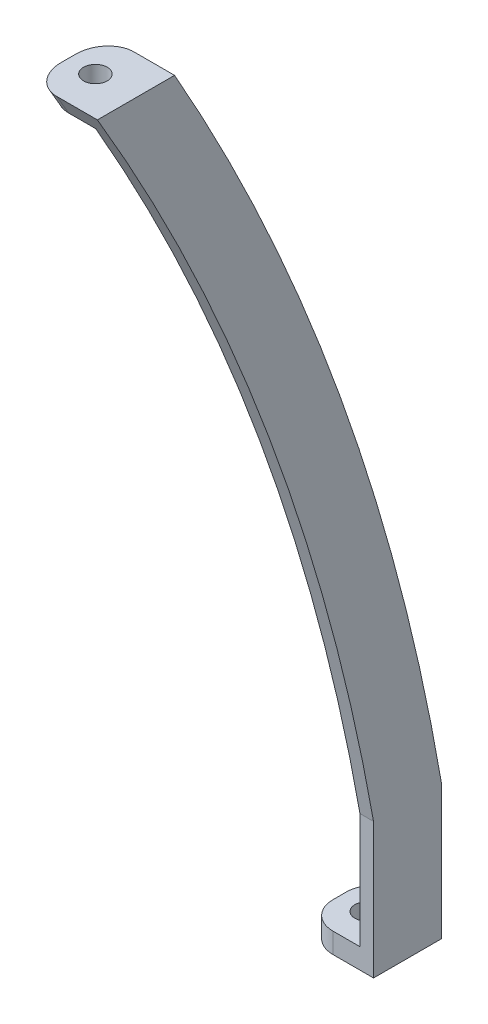
ISO-10303-21;
HEADER;
FILE_DESCRIPTION(('STEP AP214'),'2;1');
FILE_NAME('part.step','',(''),(''),'','','');
FILE_SCHEMA(('AUTOMOTIVE_DESIGN { 1 0 10303 214 1 1 1 1 }'));
ENDSEC;
DATA;
#1=APPLICATION_CONTEXT('core data for automotive mechanical design processes');
#2=APPLICATION_PROTOCOL_DEFINITION('international standard','automotive_design',2000,#1);
#3=PRODUCT_CONTEXT('',#1,'mechanical');
#4=PRODUCT('Part','Part','',(#3));
#5=PRODUCT_RELATED_PRODUCT_CATEGORY('part','',(#4));
#6=PRODUCT_DEFINITION_FORMATION('','',#4);
#7=PRODUCT_DEFINITION_CONTEXT('part definition',#1,'design');
#8=PRODUCT_DEFINITION('design','',#6,#7);
#9=PRODUCT_DEFINITION_SHAPE('','',#8);
#10=(LENGTH_UNIT() NAMED_UNIT(*) SI_UNIT(.MILLI.,.METRE.));
#11=(NAMED_UNIT(*) PLANE_ANGLE_UNIT() SI_UNIT($,.RADIAN.));
#12=(NAMED_UNIT(*) SI_UNIT($,.STERADIAN.) SOLID_ANGLE_UNIT());
#13=UNCERTAINTY_MEASURE_WITH_UNIT(LENGTH_MEASURE(1.E-05),#10,'distance_accuracy_value','');
#14=(GEOMETRIC_REPRESENTATION_CONTEXT(3) GLOBAL_UNCERTAINTY_ASSIGNED_CONTEXT((#13)) GLOBAL_UNIT_ASSIGNED_CONTEXT((#10,
#11,#12)) REPRESENTATION_CONTEXT('',''));
#15=CARTESIAN_POINT('',(0.,0.,0.));
#16=DIRECTION('',(0.,0.,1.));
#17=DIRECTION('',(1.,0.,0.));
#18=AXIS2_PLACEMENT_3D('',#15,#16,#17);
#19=CARTESIAN_POINT('',(2.,0.,0.));
#20=DIRECTION('',(0.,0.,-1.));
#21=DIRECTION('',(-1.,0.,0.));
#22=AXIS2_PLACEMENT_3D('',#19,#20,#21);
#23=PLANE('',#22);
#24=DIRECTION('',(1.,0.,0.));
#25=VECTOR('',#24,1.);
#26=CARTESIAN_POINT('',(-8.,3.,0.));
#27=LINE('',#26,#25);
#28=CARTESIAN_POINT('',(-4.,3.,0.));
#29=VERTEX_POINT('',#28);
#30=CARTESIAN_POINT('',(0.,3.,0.));
#31=VERTEX_POINT('',#30);
#32=EDGE_CURVE('E513',#29,#31,#27,.T.);
#33=ORIENTED_EDGE('',*,*,#32,.F.);
#34=DIRECTION('',(0.,-1.,0.));
#35=VECTOR('',#34,1.);
#36=CARTESIAN_POINT('',(-4.,0.,0.));
#37=LINE('',#36,#35);
#38=CARTESIAN_POINT('',(-4.,0.,0.));
#39=VERTEX_POINT('',#38);
#40=EDGE_CURVE('E11',#29,#39,#37,.T.);
#41=ORIENTED_EDGE('',*,*,#40,.T.);
#42=DIRECTION('',(-1.,0.,0.));
#43=VECTOR('',#42,1.);
#44=CARTESIAN_POINT('',(2.,0.,0.));
#45=LINE('',#44,#43);
#46=CARTESIAN_POINT('',(2.,0.,0.));
#47=VERTEX_POINT('',#46);
#48=EDGE_CURVE('E213',#47,#39,#45,.T.);
#49=ORIENTED_EDGE('',*,*,#48,.F.);
#50=DIRECTION('',(0.,-1.,0.));
#51=VECTOR('',#50,1.);
#52=CARTESIAN_POINT('',(2.,0.,0.));
#53=LINE('',#52,#51);
#54=CARTESIAN_POINT('',(2.,20.,0.));
#55=VERTEX_POINT('',#54);
#56=EDGE_CURVE('E182',#55,#47,#53,.T.);
#57=ORIENTED_EDGE('',*,*,#56,.F.);
#58=DIRECTION('',(-1.,0.,0.));
#59=VECTOR('',#58,1.);
#60=CARTESIAN_POINT('',(2.,20.,0.));
#61=LINE('',#60,#59);
#62=CARTESIAN_POINT('',(0.,20.,0.));
#63=VERTEX_POINT('',#62);
#64=EDGE_CURVE('E194',#55,#63,#61,.T.);
#65=ORIENTED_EDGE('',*,*,#64,.T.);
#66=DIRECTION('',(0.,-1.,0.));
#67=VECTOR('',#66,1.);
#68=CARTESIAN_POINT('',(0.,0.,0.));
#69=LINE('',#68,#67);
#70=EDGE_CURVE('E180',#63,#31,#69,.T.);
#71=ORIENTED_EDGE('',*,*,#70,.T.);
#72=EDGE_LOOP('',(#33,#41,#49,#57,#65,#71));
#73=FACE_BOUND('',#72,.T.);
#74=ADVANCED_FACE('F43',(#73),#23,.F.);
#75=CARTESIAN_POINT('',(2.,0.,0.));
#76=DIRECTION('',(0.,1.,0.));
#77=DIRECTION('',(0.,0.,1.));
#78=AXIS2_PLACEMENT_3D('',#75,#76,#77);
#79=PLANE('',#78);
#80=CARTESIAN_POINT('',(-4.,0.,-5.));
#81=DIRECTION('',(0.,1.,0.));
#82=DIRECTION('',(0.,0.,1.));
#83=AXIS2_PLACEMENT_3D('',#80,#81,#82);
#84=CIRCLE('',#83,1.75);
#85=CARTESIAN_POINT('',(-4.,0.,-3.25));
#86=VERTEX_POINT('',#85);
#87=EDGE_CURVE('E485',#86,#86,#84,.T.);
#88=ORIENTED_EDGE('',*,*,#87,.T.);
#89=EDGE_LOOP('',(#88));
#90=FACE_BOUND('',#89,.T.);
#91=DIRECTION('',(0.,0.,-1.));
#92=VECTOR('',#91,1.);
#93=CARTESIAN_POINT('',(-8.,0.,0.));
#94=LINE('',#93,#92);
#95=CARTESIAN_POINT('',(-8.,0.,-4.));
#96=VERTEX_POINT('',#95);
#97=CARTESIAN_POINT('',(-8.,0.,-6.));
#98=VERTEX_POINT('',#97);
#99=EDGE_CURVE('E503',#96,#98,#94,.T.);
#100=ORIENTED_EDGE('',*,*,#99,.T.);
#101=CARTESIAN_POINT('',(-4.,0.,-6.));
#102=DIRECTION('',(0.,1.,0.));
#103=DIRECTION('',(0.,0.,1.));
#104=AXIS2_PLACEMENT_3D('',#101,#102,#103);
#105=CIRCLE('',#104,4.);
#106=CARTESIAN_POINT('',(-4.,0.,-10.));
#107=VERTEX_POINT('',#106);
#108=EDGE_CURVE('E53',#98,#107,#105,.F.);
#109=ORIENTED_EDGE('',*,*,#108,.T.);
#110=DIRECTION('',(-1.,0.,0.));
#111=VECTOR('',#110,1.);
#112=CARTESIAN_POINT('',(2.,0.,-10.));
#113=LINE('',#112,#111);
#114=CARTESIAN_POINT('',(2.,0.,-10.));
#115=VERTEX_POINT('',#114);
#116=EDGE_CURVE('E209',#115,#107,#113,.T.);
#117=ORIENTED_EDGE('',*,*,#116,.F.);
#118=DIRECTION('',(0.,0.,-1.));
#119=VECTOR('',#118,1.);
#120=CARTESIAN_POINT('',(2.,0.,0.));
#121=LINE('',#120,#119);
#122=EDGE_CURVE('E188',#47,#115,#121,.T.);
#123=ORIENTED_EDGE('',*,*,#122,.F.);
#124=ORIENTED_EDGE('',*,*,#48,.T.);
#125=CARTESIAN_POINT('',(-4.,0.,-4.));
#126=DIRECTION('',(0.,1.,0.));
#127=DIRECTION('',(0.,0.,1.));
#128=AXIS2_PLACEMENT_3D('',#125,#126,#127);
#129=CIRCLE('',#128,4.);
#130=EDGE_CURVE('E61',#39,#96,#129,.F.);
#131=ORIENTED_EDGE('',*,*,#130,.T.);
#132=EDGE_LOOP('',(#100,#109,#117,#123,#124,#131));
#133=FACE_BOUND('',#132,.T.);
#134=ADVANCED_FACE('F254',(#90,#133),#79,.F.);
#135=CARTESIAN_POINT('',(2.,0.,-10.));
#136=DIRECTION('',(0.,0.,1.));
#137=DIRECTION('',(1.,0.,0.));
#138=AXIS2_PLACEMENT_3D('',#135,#136,#137);
#139=PLANE('',#138);
#140=ORIENTED_EDGE('',*,*,#116,.T.);
#141=DIRECTION('',(0.,1.,0.));
#142=VECTOR('',#141,1.);
#143=CARTESIAN_POINT('',(-4.,3.,-10.));
#144=LINE('',#143,#142);
#145=CARTESIAN_POINT('',(-4.,3.,-10.));
#146=VERTEX_POINT('',#145);
#147=EDGE_CURVE('E545',#107,#146,#144,.T.);
#148=ORIENTED_EDGE('',*,*,#147,.T.);
#149=DIRECTION('',(1.,0.,0.));
#150=VECTOR('',#149,1.);
#151=CARTESIAN_POINT('',(-8.,3.,-10.));
#152=LINE('',#151,#150);
#153=CARTESIAN_POINT('',(0.,3.,-10.));
#154=VERTEX_POINT('',#153);
#155=EDGE_CURVE('E510',#146,#154,#152,.T.);
#156=ORIENTED_EDGE('',*,*,#155,.T.);
#157=DIRECTION('',(0.,1.,0.));
#158=VECTOR('',#157,1.);
#159=CARTESIAN_POINT('',(0.,0.,-10.));
#160=LINE('',#159,#158);
#161=CARTESIAN_POINT('',(0.,20.,-10.));
#162=VERTEX_POINT('',#161);
#163=EDGE_CURVE('E190',#154,#162,#160,.T.);
#164=ORIENTED_EDGE('',*,*,#163,.T.);
#165=DIRECTION('',(-1.,0.,0.));
#166=VECTOR('',#165,1.);
#167=CARTESIAN_POINT('',(2.,20.,-10.));
#168=LINE('',#167,#166);
#169=CARTESIAN_POINT('',(2.,20.,-10.));
#170=VERTEX_POINT('',#169);
#171=EDGE_CURVE('E205',#170,#162,#168,.T.);
#172=ORIENTED_EDGE('',*,*,#171,.F.);
#173=DIRECTION('',(0.,1.,0.));
#174=VECTOR('',#173,1.);
#175=CARTESIAN_POINT('',(2.,0.,-10.));
#176=LINE('',#175,#174);
#177=EDGE_CURVE('E520',#115,#170,#176,.T.);
#178=ORIENTED_EDGE('',*,*,#177,.F.);
#179=EDGE_LOOP('',(#140,#148,#156,#164,#172,#178));
#180=FACE_BOUND('',#179,.T.);
#181=ADVANCED_FACE('F250',(#180),#139,.F.);
#182=CARTESIAN_POINT('',(2.,-37.6515685831569,324.556822155279));
#183=DIRECTION('',(-1.,0.,0.));
#184=DIRECTION('',(0.,0.,1.));
#185=AXIS2_PLACEMENT_3D('',#182,#183,#184);
#186=CYLINDRICAL_SURFACE('',#185,339.487806276952);
#187=DIRECTION('',(1.,0.,0.));
#188=VECTOR('',#187,1.);
#189=CARTESIAN_POINT('',(-8.,127.,27.6699218483719));
#190=LINE('',#189,#188);
#191=CARTESIAN_POINT('',(-4.,127.,27.6699218483719));
#192=VERTEX_POINT('',#191);
#193=CARTESIAN_POINT('',(0.,127.,27.6699218483719));
#194=VERTEX_POINT('',#193);
#195=EDGE_CURVE('E162',#192,#194,#190,.T.);
#196=ORIENTED_EDGE('',*,*,#195,.F.);
#197=CARTESIAN_POINT('',(-4.,-37.6515685831569,324.556822155279));
#198=DIRECTION('',(-1.,0.,0.));
#199=DIRECTION('',(0.,0.,1.));
#200=AXIS2_PLACEMENT_3D('',#197,#198,#199);
#201=CIRCLE('',#200,339.487806276952);
#202=CARTESIAN_POINT('',(-4.,130.,29.3536342281421));
#203=VERTEX_POINT('',#202);
#204=EDGE_CURVE('E217',#192,#203,#201,.F.);
#205=ORIENTED_EDGE('',*,*,#204,.T.);
#206=DIRECTION('',(-1.,0.,0.));
#207=VECTOR('',#206,1.);
#208=CARTESIAN_POINT('',(2.,130.,29.3536342281421));
#209=LINE('',#208,#207);
#210=CARTESIAN_POINT('',(2.,130.,29.3536342281421));
#211=VERTEX_POINT('',#210);
#212=EDGE_CURVE('E201',#211,#203,#209,.T.);
#213=ORIENTED_EDGE('',*,*,#212,.F.);
#214=CARTESIAN_POINT('',(2.,-37.6515685831569,324.556822155279));
#215=DIRECTION('',(1.,0.,0.));
#216=DIRECTION('',(0.,0.,-1.));
#217=AXIS2_PLACEMENT_3D('',#214,#215,#216);
#218=CIRCLE('',#217,339.487806276952);
#219=EDGE_CURVE('E523',#170,#211,#218,.T.);
#220=ORIENTED_EDGE('',*,*,#219,.F.);
#221=ORIENTED_EDGE('',*,*,#171,.T.);
#222=CARTESIAN_POINT('',(0.,-37.6515685831569,324.556822155279));
#223=DIRECTION('',(1.,0.,0.));
#224=DIRECTION('',(0.,0.,-1.));
#225=AXIS2_PLACEMENT_3D('',#222,#223,#224);
#226=CIRCLE('',#225,339.487806276952);
#227=EDGE_CURVE('E183',#162,#194,#226,.T.);
#228=ORIENTED_EDGE('',*,*,#227,.T.);
#229=EDGE_LOOP('',(#196,#205,#213,#220,#221,#228));
#230=FACE_BOUND('',#229,.T.);
#231=ADVANCED_FACE('F244',(#230),#186,.T.);
#232=CARTESIAN_POINT('',(2.,130.,40.7368339246421));
#233=DIRECTION('',(0.,-1.,0.));
#234=DIRECTION('',(0.,0.,-1.));
#235=AXIS2_PLACEMENT_3D('',#232,#233,#234);
#236=PLANE('',#235);
#237=CARTESIAN_POINT('',(-4.,130.,35.0316774144296));
#238=DIRECTION('',(0.,1.,0.));
#239=DIRECTION('',(0.,0.,1.));
#240=AXIS2_PLACEMENT_3D('',#237,#238,#239);
#241=CIRCLE('',#240,1.75);
#242=CARTESIAN_POINT('',(-4.,130.,36.7816774144296));
#243=VERTEX_POINT('',#242);
#244=EDGE_CURVE('E488',#243,#243,#241,.T.);
#245=ORIENTED_EDGE('',*,*,#244,.F.);
#246=EDGE_LOOP('',(#245));
#247=FACE_BOUND('',#246,.T.);
#248=ORIENTED_EDGE('',*,*,#212,.T.);
#249=CARTESIAN_POINT('',(-4.,130.,29.3536342281421));
#250=CARTESIAN_POINT('',(-4.10198030130679,130.,29.3536134423698));
#251=CARTESIAN_POINT('',(-4.20395336395629,130.,29.3581183601423));
#252=CARTESIAN_POINT('',(-4.40708358352492,130.,29.3760255167057));
#253=CARTESIAN_POINT('',(-4.50824099104414,130.,29.389424908458));
#254=CARTESIAN_POINT('',(-4.70859024217492,130.,29.4248937326831));
#255=CARTESIAN_POINT('',(-4.8077884769046,130.,29.4469271388849));
#256=CARTESIAN_POINT('',(-5.00394104876406,130.,29.4993809911471));
#257=CARTESIAN_POINT('',(-5.10089529382733,130.,29.5298017806667));
#258=CARTESIAN_POINT('',(-5.29180660545461,130.,29.5986328016678));
#259=CARTESIAN_POINT('',(-5.3857668134808,130.,29.6370343182111));
#260=CARTESIAN_POINT('',(-5.57023738286686,130.,29.7214089265049));
#261=CARTESIAN_POINT('',(-5.66074643114003,130.,29.7673848654389));
#262=CARTESIAN_POINT('',(-5.92636729750919,130.,29.9160051531414));
#263=CARTESIAN_POINT('',(-6.09561400157184,130.,30.0293570347034));
#264=CARTESIAN_POINT('',(-6.42292135268488,130.,30.2864683784742));
#265=CARTESIAN_POINT('',(-6.57999999533027,130.,30.4314645582556));
#266=CARTESIAN_POINT('',(-6.87084413063341,130.,30.743131007476));
#267=CARTESIAN_POINT('',(-7.00460507322813,130.,30.9098054960233));
#268=CARTESIAN_POINT('',(-7.26250901159009,130.,31.2818683942368));
#269=CARTESIAN_POINT('',(-7.38341799927427,130.,31.489495461655));
#270=CARTESIAN_POINT('',(-7.59330763900221,130.,31.9204582480418));
#271=CARTESIAN_POINT('',(-7.68225072779093,130.,32.1438120815668));
#272=CARTESIAN_POINT('',(-7.83675928473671,130.,32.6291055628274));
#273=CARTESIAN_POINT('',(-7.89806892645497,130.,32.8923994687754));
#274=CARTESIAN_POINT('',(-7.97966384800479,130.,33.4247273770295));
#275=CARTESIAN_POINT('',(-8.00003491297406,130.,33.6937481800675));
#276=CARTESIAN_POINT('',(-8.,130.,33.9625694383182));
#277=B_SPLINE_CURVE_WITH_KNOTS('',3,(#249,#250,#251,#252,#253,#254,#255,#256,#257,#258,#259,
#260,#261,#262,#263,#264,#265,#266,#267,#268,#269,#270,#271,#272,#273,#274,#275,#276),
.UNSPECIFIED.,.F.,.F.,(4,2,2,2,2,2,2,2,2,2,2,2,2,4),(0.,0.305830145411315,0.61156244460824,
0.916032401900834,1.22051482893697,1.52466649258254,1.82893274711312,2.43733529792629,
3.07614898915178,3.71508719509451,4.43302464456287,5.15180300781776,5.95954232078734,
6.76558727630139),.UNSPECIFIED.);
#278=CARTESIAN_POINT('',(-8.,130.,33.9625694383182));
#279=VERTEX_POINT('',#278);
#280=EDGE_CURVE('E230',#203,#279,#277,.T.);
#281=ORIENTED_EDGE('',*,*,#280,.T.);
#282=DIRECTION('',(0.,0.,1.));
#283=VECTOR('',#282,1.);
#284=CARTESIAN_POINT('',(-8.,130.,40.7368339246421));
#285=LINE('',#284,#283);
#286=CARTESIAN_POINT('',(-8.,130.,36.1007853905411));
#287=VERTEX_POINT('',#286);
#288=EDGE_CURVE('E161',#279,#287,#285,.T.);
#289=ORIENTED_EDGE('',*,*,#288,.T.);
#290=CARTESIAN_POINT('',(-8.,130.,36.1007853905411));
#291=CARTESIAN_POINT('',(-7.99997629181411,130.,36.2711857257616));
#292=CARTESIAN_POINT('',(-7.99185617783879,130.,36.4414755191078));
#293=CARTESIAN_POINT('',(-7.95936155228762,130.,36.780612192957));
#294=CARTESIAN_POINT('',(-7.93497589531301,130.,36.9494580036181));
#295=CARTESIAN_POINT('',(-7.83703469285591,130.,37.4532371533415));
#296=CARTESIAN_POINT('',(-7.73869333203849,130.,37.7837617882065));
#297=CARTESIAN_POINT('',(-7.49444628908033,130.,38.3747328471182));
#298=CARTESIAN_POINT('',(-7.35681912095346,130.,38.6385989619768));
#299=CARTESIAN_POINT('',(-7.11518155307485,130.,39.0107509696122));
#300=CARTESIAN_POINT('',(-7.02889723374093,130.,39.130727342883));
#301=CARTESIAN_POINT('',(-6.84491108192854,130.,39.3615204172951));
#302=CARTESIAN_POINT('',(-6.74721295649431,130.,39.472340072556));
#303=CARTESIAN_POINT('',(-6.48943407834496,130.,39.7357450619357));
#304=CARTESIAN_POINT('',(-6.32245356963734,130.,39.8817694926872));
#305=CARTESIAN_POINT('',(-6.05570042510512,130.,40.078459136849));
#306=CARTESIAN_POINT('',(-5.9639973587294,130.,40.1403341893832));
#307=CARTESIAN_POINT('',(-5.77562086487531,130.,40.2559595793108));
#308=CARTESIAN_POINT('',(-5.67894983672179,130.,40.3097137902302));
#309=CARTESIAN_POINT('',(-5.48057651888847,130.,40.4087500615645));
#310=CARTESIAN_POINT('',(-5.37884569064286,130.,40.4539749768186));
#311=CARTESIAN_POINT('',(-5.17170096490685,130.,40.5348798657481));
#312=CARTESIAN_POINT('',(-5.06628884717729,130.,40.5705643815432));
#313=CARTESIAN_POINT('',(-4.85277469547771,130.,40.6318267821542));
#314=CARTESIAN_POINT('',(-4.744677905551,130.,40.6574229403334));
#315=CARTESIAN_POINT('',(-4.52659052890395,130.,40.6981844613899));
#316=CARTESIAN_POINT('',(-4.41660136137697,130.,40.7133573192553));
#317=CARTESIAN_POINT('',(-4.2552398701866,130.,40.7277465842248));
#318=CARTESIAN_POINT('',(-4.20421207557927,130.,40.7311555846134));
#319=CARTESIAN_POINT('',(-4.10212543552978,130.,40.735697788186));
#320=CARTESIAN_POINT('',(-4.05106672862449,130.,40.7368341057727));
#321=CARTESIAN_POINT('',(-4.,130.,40.736833924642));
#322=B_SPLINE_CURVE_WITH_KNOTS('',3,(#290,#291,#292,#293,#294,#295,#296,#297,#298,#299,#300,
#301,#302,#303,#304,#305,#306,#307,#308,#309,#310,#311,#312,#313,#314,#315,#316,#317,#318,#319,
#320,#321),.UNSPECIFIED.,.F.,.F.,(4,2,2,2,2,2,2,2,2,2,2,2,2,2,2,4),(0.,0.510782764744076,
1.02191588568958,2.04905234969863,2.93662482001569,3.37932332547138,3.82187844630086,
4.48402704253236,4.8155772331212,5.14696877625388,5.48050731966373,5.81388678370715,
6.14665958078803,6.47919284278277,6.63257477614706,6.78574637601615),.UNSPECIFIED.);
#323=CARTESIAN_POINT('',(-4.,130.,40.7368339246421));
#324=VERTEX_POINT('',#323);
#325=EDGE_CURVE('E221',#287,#324,#322,.T.);
#326=ORIENTED_EDGE('',*,*,#325,.T.);
#327=DIRECTION('',(-1.,0.,0.));
#328=VECTOR('',#327,1.);
#329=CARTESIAN_POINT('',(2.,130.,40.7368339246421));
#330=LINE('',#329,#328);
#331=CARTESIAN_POINT('',(2.,130.,40.7368339246421));
#332=VERTEX_POINT('',#331);
#333=EDGE_CURVE('E197',#332,#324,#330,.T.);
#334=ORIENTED_EDGE('',*,*,#333,.F.);
#335=DIRECTION('',(0.,0.,1.));
#336=VECTOR('',#335,1.);
#337=CARTESIAN_POINT('',(2.,130.,40.7368339246421));
#338=LINE('',#337,#336);
#339=EDGE_CURVE('E526',#211,#332,#338,.T.);
#340=ORIENTED_EDGE('',*,*,#339,.F.);
#341=EDGE_LOOP('',(#248,#281,#289,#326,#334,#340));
#342=FACE_BOUND('',#341,.T.);
#343=ADVANCED_FACE('F239',(#247,#342),#236,.F.);
#344=CARTESIAN_POINT('',(2.,-37.6515685831569,324.556822155279));
#345=DIRECTION('',(-1.,0.,0.));
#346=DIRECTION('',(0.,0.,1.));
#347=AXIS2_PLACEMENT_3D('',#344,#345,#346);
#348=CYLINDRICAL_SURFACE('',#347,329.637428347619);
#349=ORIENTED_EDGE('',*,*,#333,.T.);
#350=CARTESIAN_POINT('',(-4.,-37.6515685831569,324.556822155279));
#351=DIRECTION('',(-1.,0.,0.));
#352=DIRECTION('',(0.,0.,1.));
#353=AXIS2_PLACEMENT_3D('',#350,#351,#352);
#354=CIRCLE('',#353,329.637428347619);
#355=CARTESIAN_POINT('',(-4.,127.,38.9859988368982));
#356=VERTEX_POINT('',#355);
#357=EDGE_CURVE('E158',#324,#356,#354,.T.);
#358=ORIENTED_EDGE('',*,*,#357,.T.);
#359=DIRECTION('',(1.,0.,0.));
#360=VECTOR('',#359,1.);
#361=CARTESIAN_POINT('',(-8.,127.,38.9859988368982));
#362=LINE('',#361,#360);
#363=CARTESIAN_POINT('',(0.,127.,38.9859988368982));
#364=VERTEX_POINT('',#363);
#365=EDGE_CURVE('E149',#356,#364,#362,.T.);
#366=ORIENTED_EDGE('',*,*,#365,.T.);
#367=CARTESIAN_POINT('',(0.,-37.6515685831569,324.556822155279));
#368=DIRECTION('',(-1.,0.,0.));
#369=DIRECTION('',(0.,0.,-1.));
#370=AXIS2_PLACEMENT_3D('',#367,#368,#369);
#371=CIRCLE('',#370,329.637428347619);
#372=EDGE_CURVE('E155',#364,#63,#371,.T.);
#373=ORIENTED_EDGE('',*,*,#372,.T.);
#374=ORIENTED_EDGE('',*,*,#64,.F.);
#375=CARTESIAN_POINT('',(2.,-37.6515685831569,324.556822155279));
#376=DIRECTION('',(-1.,0.,0.));
#377=DIRECTION('',(0.,0.,-1.));
#378=AXIS2_PLACEMENT_3D('',#375,#376,#377);
#379=CIRCLE('',#378,329.637428347619);
#380=EDGE_CURVE('E198',#332,#55,#379,.T.);
#381=ORIENTED_EDGE('',*,*,#380,.F.);
#382=EDGE_LOOP('',(#349,#358,#366,#373,#374,#381));
#383=FACE_BOUND('',#382,.T.);
#384=ADVANCED_FACE('F152',(#383),#348,.F.);
#385=CARTESIAN_POINT('',(2.,-37.6515685831569,324.556822155279));
#386=DIRECTION('',(1.,0.,0.));
#387=DIRECTION('',(0.,0.,-1.));
#388=AXIS2_PLACEMENT_3D('',#385,#386,#387);
#389=PLANE('',#388);
#390=ORIENTED_EDGE('',*,*,#56,.T.);
#391=ORIENTED_EDGE('',*,*,#122,.T.);
#392=ORIENTED_EDGE('',*,*,#177,.T.);
#393=ORIENTED_EDGE('',*,*,#219,.T.);
#394=ORIENTED_EDGE('',*,*,#339,.T.);
#395=ORIENTED_EDGE('',*,*,#380,.T.);
#396=EDGE_LOOP('',(#390,#391,#392,#393,#394,#395));
#397=FACE_BOUND('',#396,.T.);
#398=ADVANCED_FACE('F302',(#397),#389,.T.);
#399=CARTESIAN_POINT('',(0.,-37.6515685831569,324.556822155279));
#400=DIRECTION('',(1.,0.,0.));
#401=DIRECTION('',(0.,0.,-1.));
#402=AXIS2_PLACEMENT_3D('',#399,#400,#401);
#403=PLANE('',#402);
#404=ORIENTED_EDGE('',*,*,#372,.F.);
#405=DIRECTION('',(0.,0.,-1.));
#406=VECTOR('',#405,1.);
#407=CARTESIAN_POINT('',(0.,127.,38.9859988368982));
#408=LINE('',#407,#406);
#409=EDGE_CURVE('E165',#364,#194,#408,.T.);
#410=ORIENTED_EDGE('',*,*,#409,.T.);
#411=ORIENTED_EDGE('',*,*,#227,.F.);
#412=ORIENTED_EDGE('',*,*,#163,.F.);
#413=DIRECTION('',(0.,0.,1.));
#414=VECTOR('',#413,1.);
#415=CARTESIAN_POINT('',(0.,3.,0.));
#416=LINE('',#415,#414);
#417=EDGE_CURVE('E173',#154,#31,#416,.T.);
#418=ORIENTED_EDGE('',*,*,#417,.T.);
#419=ORIENTED_EDGE('',*,*,#70,.F.);
#420=EDGE_LOOP('',(#404,#410,#411,#412,#418,#419));
#421=FACE_BOUND('',#420,.T.);
#422=ADVANCED_FACE('F177',(#421),#403,.F.);
#423=CARTESIAN_POINT('',(-8.,3.,0.));
#424=DIRECTION('',(0.,1.,0.));
#425=DIRECTION('',(0.,0.,1.));
#426=AXIS2_PLACEMENT_3D('',#423,#424,#425);
#427=PLANE('',#426);
#428=CARTESIAN_POINT('',(-4.,3.,-5.));
#429=DIRECTION('',(0.,1.,0.));
#430=DIRECTION('',(0.,0.,1.));
#431=AXIS2_PLACEMENT_3D('',#428,#429,#430);
#432=CIRCLE('',#431,1.75);
#433=CARTESIAN_POINT('',(-4.,3.,-3.25));
#434=VERTEX_POINT('',#433);
#435=EDGE_CURVE('E47',#434,#434,#432,.T.);
#436=ORIENTED_EDGE('',*,*,#435,.F.);
#437=EDGE_LOOP('',(#436));
#438=FACE_BOUND('',#437,.T.);
#439=ORIENTED_EDGE('',*,*,#155,.F.);
#440=CARTESIAN_POINT('',(-4.,3.,-6.));
#441=DIRECTION('',(0.,1.,0.));
#442=DIRECTION('',(0.,0.,1.));
#443=AXIS2_PLACEMENT_3D('',#440,#441,#442);
#444=CIRCLE('',#443,4.);
#445=CARTESIAN_POINT('',(-8.,3.,-6.));
#446=VERTEX_POINT('',#445);
#447=EDGE_CURVE('E548',#146,#446,#444,.T.);
#448=ORIENTED_EDGE('',*,*,#447,.T.);
#449=DIRECTION('',(0.,0.,1.));
#450=VECTOR('',#449,1.);
#451=CARTESIAN_POINT('',(-8.,3.,0.));
#452=LINE('',#451,#450);
#453=CARTESIAN_POINT('',(-8.,3.,-4.));
#454=VERTEX_POINT('',#453);
#455=EDGE_CURVE('E506',#446,#454,#452,.T.);
#456=ORIENTED_EDGE('',*,*,#455,.T.);
#457=CARTESIAN_POINT('',(-4.,3.,-4.));
#458=DIRECTION('',(0.,1.,0.));
#459=DIRECTION('',(0.,0.,1.));
#460=AXIS2_PLACEMENT_3D('',#457,#458,#459);
#461=CIRCLE('',#460,4.);
#462=EDGE_CURVE('E550',#454,#29,#461,.T.);
#463=ORIENTED_EDGE('',*,*,#462,.T.);
#464=ORIENTED_EDGE('',*,*,#32,.T.);
#465=ORIENTED_EDGE('',*,*,#417,.F.);
#466=EDGE_LOOP('',(#439,#448,#456,#463,#464,#465));
#467=FACE_BOUND('',#466,.T.);
#468=ADVANCED_FACE('F298',(#438,#467),#427,.T.);
#469=CARTESIAN_POINT('',(-8.,0.,0.));
#470=DIRECTION('',(-1.,0.,0.));
#471=DIRECTION('',(0.,0.,1.));
#472=AXIS2_PLACEMENT_3D('',#469,#470,#471);
#473=PLANE('',#472);
#474=ORIENTED_EDGE('',*,*,#455,.F.);
#475=DIRECTION('',(0.,1.,0.));
#476=VECTOR('',#475,1.);
#477=CARTESIAN_POINT('',(-8.,0.,-6.));
#478=LINE('',#477,#476);
#479=EDGE_CURVE('E68',#446,#98,#478,.F.);
#480=ORIENTED_EDGE('',*,*,#479,.T.);
#481=ORIENTED_EDGE('',*,*,#99,.F.);
#482=DIRECTION('',(0.,-1.,0.));
#483=VECTOR('',#482,1.);
#484=CARTESIAN_POINT('',(-8.,3.,-4.));
#485=LINE('',#484,#483);
#486=EDGE_CURVE('E557',#96,#454,#485,.F.);
#487=ORIENTED_EDGE('',*,*,#486,.T.);
#488=EDGE_LOOP('',(#474,#480,#481,#487));
#489=FACE_BOUND('',#488,.T.);
#490=ADVANCED_FACE('F288',(#489),#473,.T.);
#491=CARTESIAN_POINT('',(-8.,127.,38.9859988368982));
#492=DIRECTION('',(0.,-1.,0.));
#493=DIRECTION('',(0.,0.,-1.));
#494=AXIS2_PLACEMENT_3D('',#491,#492,#493);
#495=PLANE('',#494);
#496=CARTESIAN_POINT('',(-4.,127.,35.0316774144296));
#497=DIRECTION('',(0.,-1.,0.));
#498=DIRECTION('',(0.,0.,-1.));
#499=AXIS2_PLACEMENT_3D('',#496,#497,#498);
#500=CIRCLE('',#499,1.75);
#501=CARTESIAN_POINT('',(-4.,127.,33.2816774144296));
#502=VERTEX_POINT('',#501);
#503=EDGE_CURVE('E487',#502,#502,#500,.T.);
#504=ORIENTED_EDGE('',*,*,#503,.F.);
#505=EDGE_LOOP('',(#504));
#506=FACE_BOUND('',#505,.T.);
#507=DIRECTION('',(0.,0.,-1.));
#508=VECTOR('',#507,1.);
#509=CARTESIAN_POINT('',(-8.,127.,38.9859988368982));
#510=LINE('',#509,#508);
#511=CARTESIAN_POINT('',(-8.,127.,34.3779212036096));
#512=VERTEX_POINT('',#511);
#513=CARTESIAN_POINT('',(-8.,127.,32.2523077809235));
#514=VERTEX_POINT('',#513);
#515=EDGE_CURVE('E174',#512,#514,#510,.T.);
#516=ORIENTED_EDGE('',*,*,#515,.T.);
#517=CARTESIAN_POINT('',(-8.,127.,32.2523077809235));
#518=CARTESIAN_POINT('',(-7.999991593907,127.,32.1083074055859));
#519=CARTESIAN_POINT('',(-7.99409553393404,127.,31.964364758898));
#520=CARTESIAN_POINT('',(-7.97049033521047,127.,31.6774088723548));
#521=CARTESIAN_POINT('',(-7.95277761675115,127.,31.5343959274013));
#522=CARTESIAN_POINT('',(-7.88169990893818,127.,31.107123434737));
#523=CARTESIAN_POINT('',(-7.81039464538611,127.,30.8256367492504));
#524=CARTESIAN_POINT('',(-7.61991232860097,127.,30.2784523613039));
#525=CARTESIAN_POINT('',(-7.50063424506563,127.,30.0127893475458));
#526=CARTESIAN_POINT('',(-7.28688717983042,127.,29.6344477320986));
#527=CARTESIAN_POINT('',(-7.20984333469904,127.,29.5117048055361));
#528=CARTESIAN_POINT('',(-7.04438129947504,127.,29.2741803294708));
#529=CARTESIAN_POINT('',(-6.95597023890375,127.,29.1593938585474));
#530=CARTESIAN_POINT('',(-6.77601568795609,127.,28.9483975276887));
#531=CARTESIAN_POINT('',(-6.68535130972363,127.,28.8514368785858));
#532=CARTESIAN_POINT('',(-6.49528645453083,127.,28.6665790333942));
#533=CARTESIAN_POINT('',(-6.3958911477477,127.,28.57867653949));
#534=CARTESIAN_POINT('',(-6.18892629389005,127.,28.4130584313752));
#535=CARTESIAN_POINT('',(-6.08135643448251,127.,28.3353432067089));
#536=CARTESIAN_POINT('',(-5.85885551470975,127.,28.1912905574664));
#537=CARTESIAN_POINT('',(-5.74392608467656,127.,28.1249506248672));
#538=CARTESIAN_POINT('',(-5.52392940868135,127.,28.0130022621058));
#539=CARTESIAN_POINT('',(-5.41967175678282,127.,27.9657983270202));
#540=CARTESIAN_POINT('',(-5.20721264685938,127.,27.881326942073));
#541=CARTESIAN_POINT('',(-5.09901191562312,127.,27.844057671478));
#542=CARTESIAN_POINT('',(-4.87980855176457,127.,27.78006916804));
#543=CARTESIAN_POINT('',(-4.76881301740771,127.,27.7533256111129));
#544=CARTESIAN_POINT('',(-4.54481274457456,127.,27.7106903620849));
#545=CARTESIAN_POINT('',(-4.43180949503212,127.,27.6947909464763));
#546=CARTESIAN_POINT('',(-4.26538802953311,127.,27.6795951939473));
#547=CARTESIAN_POINT('',(-4.21233493059336,127.,27.6759663859973));
#548=CARTESIAN_POINT('',(-4.10619064456874,127.,27.6711312613232));
#549=CARTESIAN_POINT('',(-4.05309960693045,127.,27.6699216630811));
#550=CARTESIAN_POINT('',(-4.,127.,27.6699218483719));
#551=B_SPLINE_CURVE_WITH_KNOTS('',3,(#517,#518,#519,#520,#521,#522,#523,#524,#525,#526,#527,
#528,#529,#530,#531,#532,#533,#534,#535,#536,#537,#538,#539,#540,#541,#542,#543,#544,#545,#546,
#547,#548,#549,#550),.UNSPECIFIED.,.F.,.F.,(4,2,2,2,2,2,2,2,2,2,2,2,2,2,2,2,4),(0.,
0.431762399111229,0.863655654664243,1.73042438967822,2.59902817052123,3.03323659587612,
3.46717400207482,3.86485023933844,4.26229255282858,4.65975005942367,5.0571198216422,
5.39998379223045,5.74278488261322,6.08478906914621,6.42654941543082,6.58603390414445,
6.74530191425802),.UNSPECIFIED.);
#552=EDGE_CURVE('E268',#514,#192,#551,.T.);
#553=ORIENTED_EDGE('',*,*,#552,.T.);
#554=ORIENTED_EDGE('',*,*,#195,.T.);
#555=ORIENTED_EDGE('',*,*,#409,.F.);
#556=ORIENTED_EDGE('',*,*,#365,.F.);
#557=CARTESIAN_POINT('',(-4.,127.,38.9859988368982));
#558=CARTESIAN_POINT('',(-4.10180495703371,127.,38.9860201009717));
#559=CARTESIAN_POINT('',(-4.20360238300738,127.,38.9815134365672));
#560=CARTESIAN_POINT('',(-4.40637837579315,127.,38.963602026245));
#561=CARTESIAN_POINT('',(-4.50735720473558,127.,38.9502002526409));
#562=CARTESIAN_POINT('',(-4.70733477428257,127.,38.9147318440899));
#563=CARTESIAN_POINT('',(-4.80634011309191,127.,38.8927023298008));
#564=CARTESIAN_POINT('',(-5.00210634589848,127.,38.8402672018072));
#565=CARTESIAN_POINT('',(-5.09886714093981,127.,38.8098612195647));
#566=CARTESIAN_POINT('',(-5.2893873853611,127.,38.7410797231683));
#567=CARTESIAN_POINT('',(-5.38315017297337,127.,38.7027134565839));
#568=CARTESIAN_POINT('',(-5.56723380027664,127.,38.6184338420232));
#569=CARTESIAN_POINT('',(-5.65755332757951,127.,38.5725176511524));
#570=CARTESIAN_POINT('',(-5.92263350170187,127.,38.4241179802857));
#571=CARTESIAN_POINT('',(-6.09154865400517,127.,38.3109713378969));
#572=CARTESIAN_POINT('',(-6.41861067601803,127.,38.0541691082692));
#573=CARTESIAN_POINT('',(-6.57574150009992,127.,37.9092334355465));
#574=CARTESIAN_POINT('',(-6.86677739646977,127.,37.5977406851203));
#575=CARTESIAN_POINT('',(-7.00067758928758,127.,37.4311790778189));
#576=CARTESIAN_POINT('',(-7.25937537316656,127.,37.0588208262884));
#577=CARTESIAN_POINT('',(-7.38086315939096,127.,36.8507273870041));
#578=CARTESIAN_POINT('',(-7.59181129363597,127.,36.4187518113258));
#579=CARTESIAN_POINT('',(-7.68123551001848,127.,36.1948522011491));
#580=CARTESIAN_POINT('',(-7.83622324554114,127.,35.7094121105631));
#581=CARTESIAN_POINT('',(-7.8976844740656,127.,35.446561807835));
#582=CARTESIAN_POINT('',(-7.97954888279783,127.,34.9150500649652));
#583=CARTESIAN_POINT('',(-8.00003210806587,127.,34.6464009921415));
#584=CARTESIAN_POINT('',(-8.,127.,34.3779212036096));
#585=B_SPLINE_CURVE_WITH_KNOTS('',3,(#557,#558,#559,#560,#561,#562,#563,#564,#565,#566,#567,
#568,#569,#570,#571,#572,#573,#574,#575,#576,#577,#578,#579,#580,#581,#582,#583,#584),
.UNSPECIFIED.,.F.,.F.,(4,2,2,2,2,2,2,2,2,2,2,2,2,4),(0.,0.305303397658565,0.610504829065287,
0.914407314331979,1.21832317247303,1.52188792471532,1.82556724594881,2.43282195383201,
3.07163993939181,3.71059194323707,4.43060334786604,5.15142358417444,5.95796603481176,
6.76293146807483),.UNSPECIFIED.);
#586=EDGE_CURVE('E277',#356,#512,#585,.T.);
#587=ORIENTED_EDGE('',*,*,#586,.T.);
#588=EDGE_LOOP('',(#516,#553,#554,#555,#556,#587));
#589=FACE_BOUND('',#588,.T.);
#590=ADVANCED_FACE('F167',(#506,#589),#495,.T.);
#591=CARTESIAN_POINT('',(-8.,-37.6515685877969,324.556822163228));
#592=DIRECTION('',(-1.,0.,0.));
#593=DIRECTION('',(0.,0.,1.));
#594=AXIS2_PLACEMENT_3D('',#591,#592,#593);
#595=PLANE('',#594);
#596=ORIENTED_EDGE('',*,*,#288,.F.);
#597=CARTESIAN_POINT('',(-8.,-37.6515685831569,324.556822155279));
#598=DIRECTION('',(-1.,0.,0.));
#599=DIRECTION('',(0.,0.,1.));
#600=AXIS2_PLACEMENT_3D('',#597,#598,#599);
#601=CIRCLE('',#600,335.487806276952);
#602=EDGE_CURVE('E577',#279,#514,#601,.T.);
#603=ORIENTED_EDGE('',*,*,#602,.T.);
#604=ORIENTED_EDGE('',*,*,#515,.F.);
#605=CARTESIAN_POINT('',(-8.,-37.6515685831569,324.556822155279));
#606=DIRECTION('',(-1.,0.,0.));
#607=DIRECTION('',(0.,0.,1.));
#608=AXIS2_PLACEMENT_3D('',#605,#606,#607);
#609=CIRCLE('',#608,333.637428347619);
#610=EDGE_CURVE('E574',#512,#287,#609,.F.);
#611=ORIENTED_EDGE('',*,*,#610,.T.);
#612=EDGE_LOOP('',(#596,#603,#604,#611));
#613=FACE_BOUND('',#612,.T.);
#614=ADVANCED_FACE('F264',(#613),#595,.T.);
#615=CARTESIAN_POINT('',(-4.,-37.6515685831569,324.556822155279));
#616=DIRECTION('',(-1.,0.,0.));
#617=DIRECTION('',(0.,0.,1.));
#618=AXIS2_PLACEMENT_3D('',#615,#616,#617);
#619=TOROIDAL_SURFACE('',#618,335.487806276952,4.);
#620=ORIENTED_EDGE('',*,*,#552,.F.);
#621=ORIENTED_EDGE('',*,*,#602,.F.);
#622=ORIENTED_EDGE('',*,*,#280,.F.);
#623=ORIENTED_EDGE('',*,*,#204,.F.);
#624=EDGE_LOOP('',(#620,#621,#622,#623));
#625=FACE_BOUND('',#624,.T.);
#626=ADVANCED_FACE('F261',(#625),#619,.T.);
#627=CARTESIAN_POINT('',(-4.,-37.6515685831569,324.556822155279));
#628=DIRECTION('',(-1.,0.,0.));
#629=DIRECTION('',(0.,0.,1.));
#630=AXIS2_PLACEMENT_3D('',#627,#628,#629);
#631=TOROIDAL_SURFACE('',#630,333.637428347619,4.);
#632=ORIENTED_EDGE('',*,*,#325,.F.);
#633=ORIENTED_EDGE('',*,*,#610,.F.);
#634=ORIENTED_EDGE('',*,*,#586,.F.);
#635=ORIENTED_EDGE('',*,*,#357,.F.);
#636=EDGE_LOOP('',(#632,#633,#634,#635));
#637=FACE_BOUND('',#636,.T.);
#638=ADVANCED_FACE('F237',(#637),#631,.T.);
#639=CARTESIAN_POINT('',(-4.,0.,-6.));
#640=DIRECTION('',(0.,-1.,0.));
#641=DIRECTION('',(0.,0.,-1.));
#642=AXIS2_PLACEMENT_3D('',#639,#640,#641);
#643=CYLINDRICAL_SURFACE('',#642,4.);
#644=ORIENTED_EDGE('',*,*,#108,.F.);
#645=ORIENTED_EDGE('',*,*,#479,.F.);
#646=ORIENTED_EDGE('',*,*,#447,.F.);
#647=ORIENTED_EDGE('',*,*,#147,.F.);
#648=EDGE_LOOP('',(#644,#645,#646,#647));
#649=FACE_BOUND('',#648,.T.);
#650=ADVANCED_FACE('F341',(#649),#643,.T.);
#651=CARTESIAN_POINT('',(-4.,0.,-4.));
#652=DIRECTION('',(0.,1.,0.));
#653=DIRECTION('',(0.,0.,1.));
#654=AXIS2_PLACEMENT_3D('',#651,#652,#653);
#655=CYLINDRICAL_SURFACE('',#654,4.);
#656=ORIENTED_EDGE('',*,*,#462,.F.);
#657=ORIENTED_EDGE('',*,*,#486,.F.);
#658=ORIENTED_EDGE('',*,*,#130,.F.);
#659=ORIENTED_EDGE('',*,*,#40,.F.);
#660=EDGE_LOOP('',(#656,#657,#658,#659));
#661=FACE_BOUND('',#660,.T.);
#662=ADVANCED_FACE('F45',(#661),#655,.T.);
#663=CARTESIAN_POINT('',(-4.,0.,35.0316774144296));
#664=DIRECTION('',(0.,1.,0.));
#665=DIRECTION('',(0.,0.,1.));
#666=AXIS2_PLACEMENT_3D('',#663,#664,#665);
#667=CYLINDRICAL_SURFACE('',#666,1.75);
#668=ORIENTED_EDGE('',*,*,#503,.T.);
#669=EDGE_LOOP('',(#668));
#670=FACE_BOUND('',#669,.T.);
#671=ORIENTED_EDGE('',*,*,#244,.T.);
#672=EDGE_LOOP('',(#671));
#673=FACE_BOUND('',#672,.T.);
#674=ADVANCED_FACE('F290',(#670,#673),#667,.F.);
#675=CARTESIAN_POINT('',(-4.,0.,-5.));
#676=DIRECTION('',(0.,1.,0.));
#677=DIRECTION('',(0.,0.,1.));
#678=AXIS2_PLACEMENT_3D('',#675,#676,#677);
#679=CYLINDRICAL_SURFACE('',#678,1.75);
#680=ORIENTED_EDGE('',*,*,#435,.T.);
#681=EDGE_LOOP('',(#680));
#682=FACE_BOUND('',#681,.T.);
#683=ORIENTED_EDGE('',*,*,#87,.F.);
#684=EDGE_LOOP('',(#683));
#685=FACE_BOUND('',#684,.T.);
#686=ADVANCED_FACE('F359',(#682,#685),#679,.F.);
#687=CLOSED_SHELL('',(#74,#134,#181,#231,#343,#384,#398,#422,#468,#490,#590,#614,#626,#638,#650,
#662,#674,#686));
#688=MANIFOLD_SOLID_BREP('B2',#687);
#689=ADVANCED_BREP_SHAPE_REPRESENTATION('',(#18,#688),#14);
#690=SHAPE_DEFINITION_REPRESENTATION(#9,#689);
ENDSEC;
END-ISO-10303-21;
